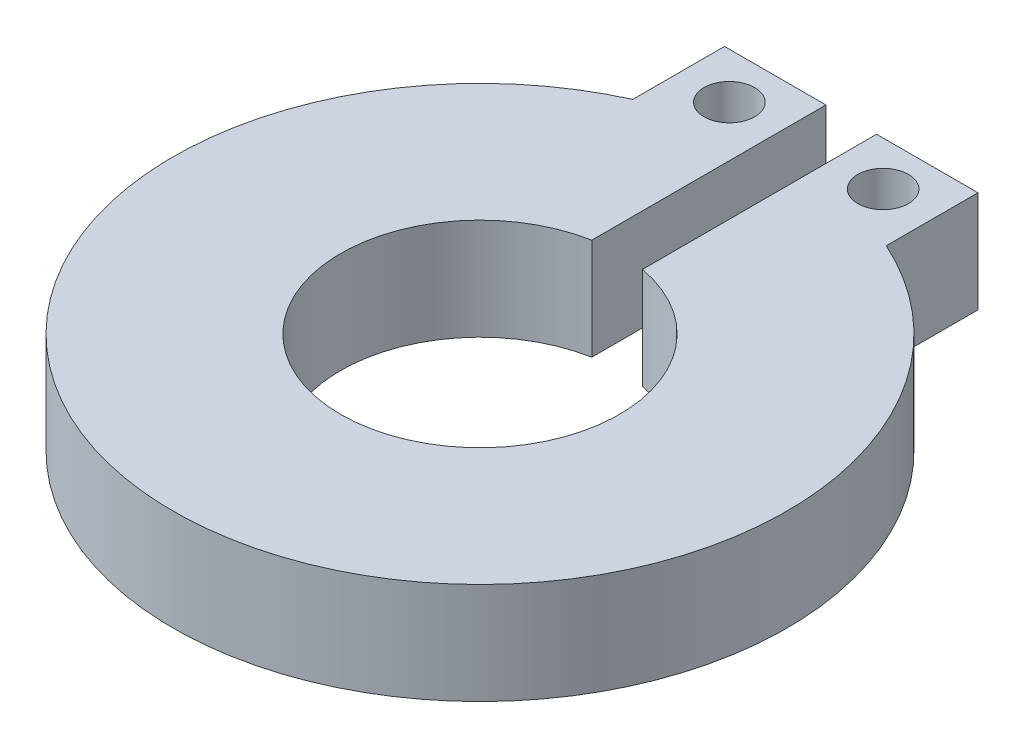
ISO-10303-21;
HEADER;
FILE_DESCRIPTION(('STEP AP214'),'2;1');
FILE_NAME('part.step','',(''),(''),'','','');
FILE_SCHEMA(('AUTOMOTIVE_DESIGN { 1 0 10303 214 1 1 1 1 }'));
ENDSEC;
DATA;
#1=APPLICATION_CONTEXT('core data for automotive mechanical design processes');
#2=APPLICATION_PROTOCOL_DEFINITION('international standard','automotive_design',2000,#1);
#3=PRODUCT_CONTEXT('',#1,'mechanical');
#4=PRODUCT('Part','Part','',(#3));
#5=PRODUCT_RELATED_PRODUCT_CATEGORY('part','',(#4));
#6=PRODUCT_DEFINITION_FORMATION('','',#4);
#7=PRODUCT_DEFINITION_CONTEXT('part definition',#1,'design');
#8=PRODUCT_DEFINITION('design','',#6,#7);
#9=PRODUCT_DEFINITION_SHAPE('','',#8);
#10=(LENGTH_UNIT() NAMED_UNIT(*) SI_UNIT(.MILLI.,.METRE.));
#11=(NAMED_UNIT(*) PLANE_ANGLE_UNIT() SI_UNIT($,.RADIAN.));
#12=(NAMED_UNIT(*) SI_UNIT($,.STERADIAN.) SOLID_ANGLE_UNIT());
#13=UNCERTAINTY_MEASURE_WITH_UNIT(LENGTH_MEASURE(1.E-05),#10,'distance_accuracy_value','');
#14=(GEOMETRIC_REPRESENTATION_CONTEXT(3) GLOBAL_UNCERTAINTY_ASSIGNED_CONTEXT((#13)) GLOBAL_UNIT_ASSIGNED_CONTEXT((#10,
#11,#12)) REPRESENTATION_CONTEXT('',''));
#15=CARTESIAN_POINT('',(0.,0.,0.));
#16=DIRECTION('',(0.,0.,1.));
#17=DIRECTION('',(1.,0.,0.));
#18=AXIS2_PLACEMENT_3D('',#15,#16,#17);
#19=CARTESIAN_POINT('',(-5.,4.,0.));
#20=DIRECTION('',(1.,0.,0.));
#21=DIRECTION('',(0.,0.,-1.));
#22=AXIS2_PLACEMENT_3D('',#19,#20,#21);
#23=PLANE('',#22);
#24=DIRECTION('',(0.,0.,1.));
#25=VECTOR('',#24,1.);
#26=CARTESIAN_POINT('',(-5.,0.,0.));
#27=LINE('',#26,#25);
#28=CARTESIAN_POINT('',(-5.,0.,-14.6456807691792));
#29=VERTEX_POINT('',#28);
#30=CARTESIAN_POINT('',(-5.,0.,-11.0261060764355));
#31=VERTEX_POINT('',#30);
#32=EDGE_CURVE('E160',#29,#31,#27,.T.);
#33=ORIENTED_EDGE('',*,*,#32,.T.);
#34=DIRECTION('',(0.,-1.,0.));
#35=VECTOR('',#34,1.);
#36=CARTESIAN_POINT('',(-5.,4.,-11.0261060764355));
#37=LINE('',#36,#35);
#38=CARTESIAN_POINT('',(-5.,4.,-11.0261060764355));
#39=VERTEX_POINT('',#38);
#40=EDGE_CURVE('E11',#39,#31,#37,.T.);
#41=ORIENTED_EDGE('',*,*,#40,.F.);
#42=DIRECTION('',(0.,0.,1.));
#43=VECTOR('',#42,1.);
#44=CARTESIAN_POINT('',(-5.,4.,0.));
#45=LINE('',#44,#43);
#46=CARTESIAN_POINT('',(-5.,4.,-14.6456807691792));
#47=VERTEX_POINT('',#46);
#48=EDGE_CURVE('E219',#47,#39,#45,.T.);
#49=ORIENTED_EDGE('',*,*,#48,.F.);
#50=DIRECTION('',(0.,-1.,0.));
#51=VECTOR('',#50,1.);
#52=CARTESIAN_POINT('',(-5.,4.,-14.6456807691792));
#53=LINE('',#52,#51);
#54=EDGE_CURVE('E151',#47,#29,#53,.T.);
#55=ORIENTED_EDGE('',*,*,#54,.T.);
#56=EDGE_LOOP('',(#33,#41,#49,#55));
#57=FACE_BOUND('',#56,.T.);
#58=ADVANCED_FACE('F47',(#57),#23,.F.);
#59=CARTESIAN_POINT('',(0.,4.,0.));
#60=DIRECTION('',(0.,-1.,0.));
#61=DIRECTION('',(0.,0.,-1.));
#62=AXIS2_PLACEMENT_3D('',#59,#60,#61);
#63=CYLINDRICAL_SURFACE('',#62,12.1068168900338);
#64=CARTESIAN_POINT('',(0.,0.,0.));
#65=DIRECTION('',(0.,1.,0.));
#66=DIRECTION('',(0.,0.,1.));
#67=AXIS2_PLACEMENT_3D('',#64,#65,#66);
#68=CIRCLE('',#67,12.1068168900338);
#69=CARTESIAN_POINT('',(5.,0.,-11.0261060764355));
#70=VERTEX_POINT('',#69);
#71=EDGE_CURVE('E164',#31,#70,#68,.T.);
#72=ORIENTED_EDGE('',*,*,#71,.T.);
#73=DIRECTION('',(0.,-1.,0.));
#74=VECTOR('',#73,1.);
#75=CARTESIAN_POINT('',(5.,4.,-11.0261060764355));
#76=LINE('',#75,#74);
#77=CARTESIAN_POINT('',(5.,4.,-11.0261060764355));
#78=VERTEX_POINT('',#77);
#79=EDGE_CURVE('E57',#78,#70,#76,.T.);
#80=ORIENTED_EDGE('',*,*,#79,.F.);
#81=CARTESIAN_POINT('',(0.,4.,0.));
#82=DIRECTION('',(0.,1.,0.));
#83=DIRECTION('',(0.,0.,1.));
#84=AXIS2_PLACEMENT_3D('',#81,#82,#83);
#85=CIRCLE('',#84,12.1068168900338);
#86=EDGE_CURVE('E107',#39,#78,#85,.T.);
#87=ORIENTED_EDGE('',*,*,#86,.F.);
#88=ORIENTED_EDGE('',*,*,#40,.T.);
#89=EDGE_LOOP('',(#72,#80,#87,#88));
#90=FACE_BOUND('',#89,.T.);
#91=ADVANCED_FACE('F205',(#90),#63,.T.);
#92=CARTESIAN_POINT('',(5.,4.,0.));
#93=DIRECTION('',(1.,0.,0.));
#94=DIRECTION('',(0.,0.,-1.));
#95=AXIS2_PLACEMENT_3D('',#92,#93,#94);
#96=PLANE('',#95);
#97=DIRECTION('',(0.,0.,1.));
#98=VECTOR('',#97,1.);
#99=CARTESIAN_POINT('',(5.,0.,0.));
#100=LINE('',#99,#98);
#101=CARTESIAN_POINT('',(5.,0.,-14.6456807691792));
#102=VERTEX_POINT('',#101);
#103=EDGE_CURVE('E168',#102,#70,#100,.T.);
#104=ORIENTED_EDGE('',*,*,#103,.F.);
#105=DIRECTION('',(0.,-1.,0.));
#106=VECTOR('',#105,1.);
#107=CARTESIAN_POINT('',(5.,4.,-14.6456807691792));
#108=LINE('',#107,#106);
#109=CARTESIAN_POINT('',(5.,4.,-14.6456807691792));
#110=VERTEX_POINT('',#109);
#111=EDGE_CURVE('E196',#110,#102,#108,.T.);
#112=ORIENTED_EDGE('',*,*,#111,.F.);
#113=DIRECTION('',(0.,0.,1.));
#114=VECTOR('',#113,1.);
#115=CARTESIAN_POINT('',(5.,4.,0.));
#116=LINE('',#115,#114);
#117=EDGE_CURVE('E204',#110,#78,#116,.T.);
#118=ORIENTED_EDGE('',*,*,#117,.T.);
#119=ORIENTED_EDGE('',*,*,#79,.T.);
#120=EDGE_LOOP('',(#104,#112,#118,#119));
#121=FACE_BOUND('',#120,.T.);
#122=ADVANCED_FACE('F202',(#121),#96,.T.);
#123=CARTESIAN_POINT('',(0.,4.,-14.6456807691792));
#124=DIRECTION('',(0.,0.,-1.));
#125=DIRECTION('',(-1.,0.,0.));
#126=AXIS2_PLACEMENT_3D('',#123,#124,#125);
#127=PLANE('',#126);
#128=DIRECTION('',(1.,0.,0.));
#129=VECTOR('',#128,1.);
#130=CARTESIAN_POINT('',(0.,0.,-14.6456807691792));
#131=LINE('',#130,#129);
#132=CARTESIAN_POINT('',(1.,0.,-14.6456807691792));
#133=VERTEX_POINT('',#132);
#134=EDGE_CURVE('E172',#133,#102,#131,.T.);
#135=ORIENTED_EDGE('',*,*,#134,.F.);
#136=DIRECTION('',(0.,-1.,0.));
#137=VECTOR('',#136,1.);
#138=CARTESIAN_POINT('',(1.,4.,-14.6456807691792));
#139=LINE('',#138,#137);
#140=CARTESIAN_POINT('',(1.,4.,-14.6456807691792));
#141=VERTEX_POINT('',#140);
#142=EDGE_CURVE('E193',#141,#133,#139,.T.);
#143=ORIENTED_EDGE('',*,*,#142,.F.);
#144=DIRECTION('',(1.,0.,0.));
#145=VECTOR('',#144,1.);
#146=CARTESIAN_POINT('',(0.,4.,-14.6456807691792));
#147=LINE('',#146,#145);
#148=EDGE_CURVE('E145',#141,#110,#147,.T.);
#149=ORIENTED_EDGE('',*,*,#148,.T.);
#150=ORIENTED_EDGE('',*,*,#111,.T.);
#151=EDGE_LOOP('',(#135,#143,#149,#150));
#152=FACE_BOUND('',#151,.T.);
#153=ADVANCED_FACE('F213',(#152),#127,.T.);
#154=CARTESIAN_POINT('',(1.,4.,0.));
#155=DIRECTION('',(-1.,0.,0.));
#156=DIRECTION('',(0.,0.,1.));
#157=AXIS2_PLACEMENT_3D('',#154,#155,#156);
#158=PLANE('',#157);
#159=DIRECTION('',(0.,0.,-1.));
#160=VECTOR('',#159,1.);
#161=CARTESIAN_POINT('',(1.,0.,0.));
#162=LINE('',#161,#160);
#163=CARTESIAN_POINT('',(1.,0.,-5.40832691319598));
#164=VERTEX_POINT('',#163);
#165=EDGE_CURVE('E176',#164,#133,#162,.T.);
#166=ORIENTED_EDGE('',*,*,#165,.F.);
#167=DIRECTION('',(0.,-1.,0.));
#168=VECTOR('',#167,1.);
#169=CARTESIAN_POINT('',(1.,4.,-5.40832691319598));
#170=LINE('',#169,#168);
#171=CARTESIAN_POINT('',(1.,4.,-5.40832691319598));
#172=VERTEX_POINT('',#171);
#173=EDGE_CURVE('E130',#172,#164,#170,.T.);
#174=ORIENTED_EDGE('',*,*,#173,.F.);
#175=DIRECTION('',(0.,0.,-1.));
#176=VECTOR('',#175,1.);
#177=CARTESIAN_POINT('',(1.,4.,0.));
#178=LINE('',#177,#176);
#179=EDGE_CURVE('E141',#172,#141,#178,.T.);
#180=ORIENTED_EDGE('',*,*,#179,.T.);
#181=ORIENTED_EDGE('',*,*,#142,.T.);
#182=EDGE_LOOP('',(#166,#174,#180,#181));
#183=FACE_BOUND('',#182,.T.);
#184=ADVANCED_FACE('F263',(#183),#158,.T.);
#185=CARTESIAN_POINT('',(0.,4.,0.));
#186=DIRECTION('',(0.,-1.,0.));
#187=DIRECTION('',(0.,0.,-1.));
#188=AXIS2_PLACEMENT_3D('',#185,#186,#187);
#189=CYLINDRICAL_SURFACE('',#188,5.5);
#190=CARTESIAN_POINT('',(0.,0.,0.));
#191=DIRECTION('',(0.,1.,0.));
#192=DIRECTION('',(0.,0.,1.));
#193=AXIS2_PLACEMENT_3D('',#190,#191,#192);
#194=CIRCLE('',#193,5.5);
#195=CARTESIAN_POINT('',(-1.,0.,-5.40832691319598));
#196=VERTEX_POINT('',#195);
#197=EDGE_CURVE('E128',#196,#164,#194,.T.);
#198=ORIENTED_EDGE('',*,*,#197,.F.);
#199=DIRECTION('',(0.,-1.,0.));
#200=VECTOR('',#199,1.);
#201=CARTESIAN_POINT('',(-1.,4.,-5.40832691319598));
#202=LINE('',#201,#200);
#203=CARTESIAN_POINT('',(-1.,4.,-5.40832691319598));
#204=VERTEX_POINT('',#203);
#205=EDGE_CURVE('E122',#204,#196,#202,.T.);
#206=ORIENTED_EDGE('',*,*,#205,.F.);
#207=CARTESIAN_POINT('',(0.,4.,0.));
#208=DIRECTION('',(0.,1.,0.));
#209=DIRECTION('',(0.,0.,1.));
#210=AXIS2_PLACEMENT_3D('',#207,#208,#209);
#211=CIRCLE('',#210,5.5);
#212=EDGE_CURVE('E126',#204,#172,#211,.T.);
#213=ORIENTED_EDGE('',*,*,#212,.T.);
#214=ORIENTED_EDGE('',*,*,#173,.T.);
#215=EDGE_LOOP('',(#198,#206,#213,#214));
#216=FACE_BOUND('',#215,.T.);
#217=ADVANCED_FACE('F124',(#216),#189,.F.);
#218=CARTESIAN_POINT('',(-1.,4.,0.));
#219=DIRECTION('',(-1.,0.,0.));
#220=DIRECTION('',(0.,0.,1.));
#221=AXIS2_PLACEMENT_3D('',#218,#219,#220);
#222=PLANE('',#221);
#223=DIRECTION('',(0.,0.,-1.));
#224=VECTOR('',#223,1.);
#225=CARTESIAN_POINT('',(-1.,0.,0.));
#226=LINE('',#225,#224);
#227=CARTESIAN_POINT('',(-1.,0.,-14.6456807691792));
#228=VERTEX_POINT('',#227);
#229=EDGE_CURVE('E93',#196,#228,#226,.T.);
#230=ORIENTED_EDGE('',*,*,#229,.T.);
#231=DIRECTION('',(0.,-1.,0.));
#232=VECTOR('',#231,1.);
#233=CARTESIAN_POINT('',(-1.,4.,-14.6456807691792));
#234=LINE('',#233,#232);
#235=CARTESIAN_POINT('',(-1.,4.,-14.6456807691792));
#236=VERTEX_POINT('',#235);
#237=EDGE_CURVE('E131',#236,#228,#234,.T.);
#238=ORIENTED_EDGE('',*,*,#237,.F.);
#239=DIRECTION('',(0.,0.,-1.));
#240=VECTOR('',#239,1.);
#241=CARTESIAN_POINT('',(-1.,4.,0.));
#242=LINE('',#241,#240);
#243=EDGE_CURVE('E133',#204,#236,#242,.T.);
#244=ORIENTED_EDGE('',*,*,#243,.F.);
#245=ORIENTED_EDGE('',*,*,#205,.T.);
#246=EDGE_LOOP('',(#230,#238,#244,#245));
#247=FACE_BOUND('',#246,.T.);
#248=ADVANCED_FACE('F134',(#247),#222,.F.);
#249=CARTESIAN_POINT('',(-3.,4.,-12.8358934228073));
#250=DIRECTION('',(0.,-1.,0.));
#251=DIRECTION('',(0.,0.,-1.));
#252=AXIS2_PLACEMENT_3D('',#249,#250,#251);
#253=CYLINDRICAL_SURFACE('',#252,1.);
#254=CARTESIAN_POINT('',(-3.,4.,-12.8358934228073));
#255=DIRECTION('',(0.,1.,0.));
#256=DIRECTION('',(0.,0.,1.));
#257=AXIS2_PLACEMENT_3D('',#254,#255,#256);
#258=CIRCLE('',#257,1.);
#259=CARTESIAN_POINT('',(-3.,4.,-11.8358934228073));
#260=VERTEX_POINT('',#259);
#261=EDGE_CURVE('E224',#260,#260,#258,.T.);
#262=ORIENTED_EDGE('',*,*,#261,.T.);
#263=EDGE_LOOP('',(#262));
#264=FACE_BOUND('',#263,.T.);
#265=CARTESIAN_POINT('',(-3.,0.,-12.8358934228073));
#266=DIRECTION('',(0.,1.,0.));
#267=DIRECTION('',(0.,0.,1.));
#268=AXIS2_PLACEMENT_3D('',#265,#266,#267);
#269=CIRCLE('',#268,1.);
#270=CARTESIAN_POINT('',(-3.,0.,-11.8358934228073));
#271=VERTEX_POINT('',#270);
#272=EDGE_CURVE('E156',#271,#271,#269,.T.);
#273=ORIENTED_EDGE('',*,*,#272,.F.);
#274=EDGE_LOOP('',(#273));
#275=FACE_BOUND('',#274,.T.);
#276=ADVANCED_FACE('F240',(#264,#275),#253,.F.);
#277=CARTESIAN_POINT('',(3.,4.,-12.9031273568032));
#278=DIRECTION('',(0.,-1.,0.));
#279=DIRECTION('',(0.,0.,-1.));
#280=AXIS2_PLACEMENT_3D('',#277,#278,#279);
#281=CYLINDRICAL_SURFACE('',#280,1.);
#282=CARTESIAN_POINT('',(3.,4.,-12.9031273568032));
#283=DIRECTION('',(0.,1.,0.));
#284=DIRECTION('',(0.,0.,1.));
#285=AXIS2_PLACEMENT_3D('',#282,#283,#284);
#286=CIRCLE('',#285,1.);
#287=CARTESIAN_POINT('',(3.,4.,-11.9031273568032));
#288=VERTEX_POINT('',#287);
#289=EDGE_CURVE('E186',#288,#288,#286,.T.);
#290=ORIENTED_EDGE('',*,*,#289,.T.);
#291=EDGE_LOOP('',(#290));
#292=FACE_BOUND('',#291,.T.);
#293=CARTESIAN_POINT('',(3.,0.,-12.9031273568032));
#294=DIRECTION('',(0.,1.,0.));
#295=DIRECTION('',(0.,0.,1.));
#296=AXIS2_PLACEMENT_3D('',#293,#294,#295);
#297=CIRCLE('',#296,1.);
#298=CARTESIAN_POINT('',(3.,0.,-11.9031273568032));
#299=VERTEX_POINT('',#298);
#300=EDGE_CURVE('E152',#299,#299,#297,.T.);
#301=ORIENTED_EDGE('',*,*,#300,.F.);
#302=EDGE_LOOP('',(#301));
#303=FACE_BOUND('',#302,.T.);
#304=ADVANCED_FACE('F49',(#292,#303),#281,.F.);
#305=CARTESIAN_POINT('',(0.,4.,-14.6456807691792));
#306=DIRECTION('',(0.,0.,1.));
#307=DIRECTION('',(1.,0.,0.));
#308=AXIS2_PLACEMENT_3D('',#305,#306,#307);
#309=PLANE('',#308);
#310=DIRECTION('',(-1.,0.,0.));
#311=VECTOR('',#310,1.);
#312=CARTESIAN_POINT('',(0.,0.,-14.6456807691792));
#313=LINE('',#312,#311);
#314=EDGE_CURVE('E99',#228,#29,#313,.T.);
#315=ORIENTED_EDGE('',*,*,#314,.T.);
#316=ORIENTED_EDGE('',*,*,#54,.F.);
#317=DIRECTION('',(-1.,0.,0.));
#318=VECTOR('',#317,1.);
#319=CARTESIAN_POINT('',(0.,4.,-14.6456807691792));
#320=LINE('',#319,#318);
#321=EDGE_CURVE('E65',#236,#47,#320,.T.);
#322=ORIENTED_EDGE('',*,*,#321,.F.);
#323=ORIENTED_EDGE('',*,*,#237,.T.);
#324=EDGE_LOOP('',(#315,#316,#322,#323));
#325=FACE_BOUND('',#324,.T.);
#326=ADVANCED_FACE('F236',(#325),#309,.F.);
#327=CARTESIAN_POINT('',(0.,4.,0.));
#328=DIRECTION('',(0.,1.,0.));
#329=DIRECTION('',(0.,0.,1.));
#330=AXIS2_PLACEMENT_3D('',#327,#328,#329);
#331=PLANE('',#330);
#332=ORIENTED_EDGE('',*,*,#289,.F.);
#333=EDGE_LOOP('',(#332));
#334=FACE_BOUND('',#333,.T.);
#335=ORIENTED_EDGE('',*,*,#261,.F.);
#336=EDGE_LOOP('',(#335));
#337=FACE_BOUND('',#336,.T.);
#338=ORIENTED_EDGE('',*,*,#48,.T.);
#339=ORIENTED_EDGE('',*,*,#86,.T.);
#340=ORIENTED_EDGE('',*,*,#117,.F.);
#341=ORIENTED_EDGE('',*,*,#148,.F.);
#342=ORIENTED_EDGE('',*,*,#179,.F.);
#343=ORIENTED_EDGE('',*,*,#212,.F.);
#344=ORIENTED_EDGE('',*,*,#243,.T.);
#345=ORIENTED_EDGE('',*,*,#321,.T.);
#346=EDGE_LOOP('',(#338,#339,#340,#341,#342,#343,#344,#345));
#347=FACE_BOUND('',#346,.T.);
#348=ADVANCED_FACE('F138',(#334,#337,#347),#331,.T.);
#349=CARTESIAN_POINT('',(0.,0.,0.));
#350=DIRECTION('',(0.,1.,0.));
#351=DIRECTION('',(0.,0.,1.));
#352=AXIS2_PLACEMENT_3D('',#349,#350,#351);
#353=PLANE('',#352);
#354=ORIENTED_EDGE('',*,*,#300,.T.);
#355=EDGE_LOOP('',(#354));
#356=FACE_BOUND('',#355,.T.);
#357=ORIENTED_EDGE('',*,*,#272,.T.);
#358=EDGE_LOOP('',(#357));
#359=FACE_BOUND('',#358,.T.);
#360=ORIENTED_EDGE('',*,*,#32,.F.);
#361=ORIENTED_EDGE('',*,*,#314,.F.);
#362=ORIENTED_EDGE('',*,*,#229,.F.);
#363=ORIENTED_EDGE('',*,*,#197,.T.);
#364=ORIENTED_EDGE('',*,*,#165,.T.);
#365=ORIENTED_EDGE('',*,*,#134,.T.);
#366=ORIENTED_EDGE('',*,*,#103,.T.);
#367=ORIENTED_EDGE('',*,*,#71,.F.);
#368=EDGE_LOOP('',(#360,#361,#362,#363,#364,#365,#366,#367));
#369=FACE_BOUND('',#368,.T.);
#370=ADVANCED_FACE('F209',(#356,#359,#369),#353,.F.);
#371=CLOSED_SHELL('',(#58,#91,#122,#153,#184,#217,#248,#276,#304,#326,#348,#370));
#372=MANIFOLD_SOLID_BREP('B2',#371);
#373=ADVANCED_BREP_SHAPE_REPRESENTATION('',(#18,#372),#14);
#374=SHAPE_DEFINITION_REPRESENTATION(#9,#373);
ENDSEC;
END-ISO-10303-21;
